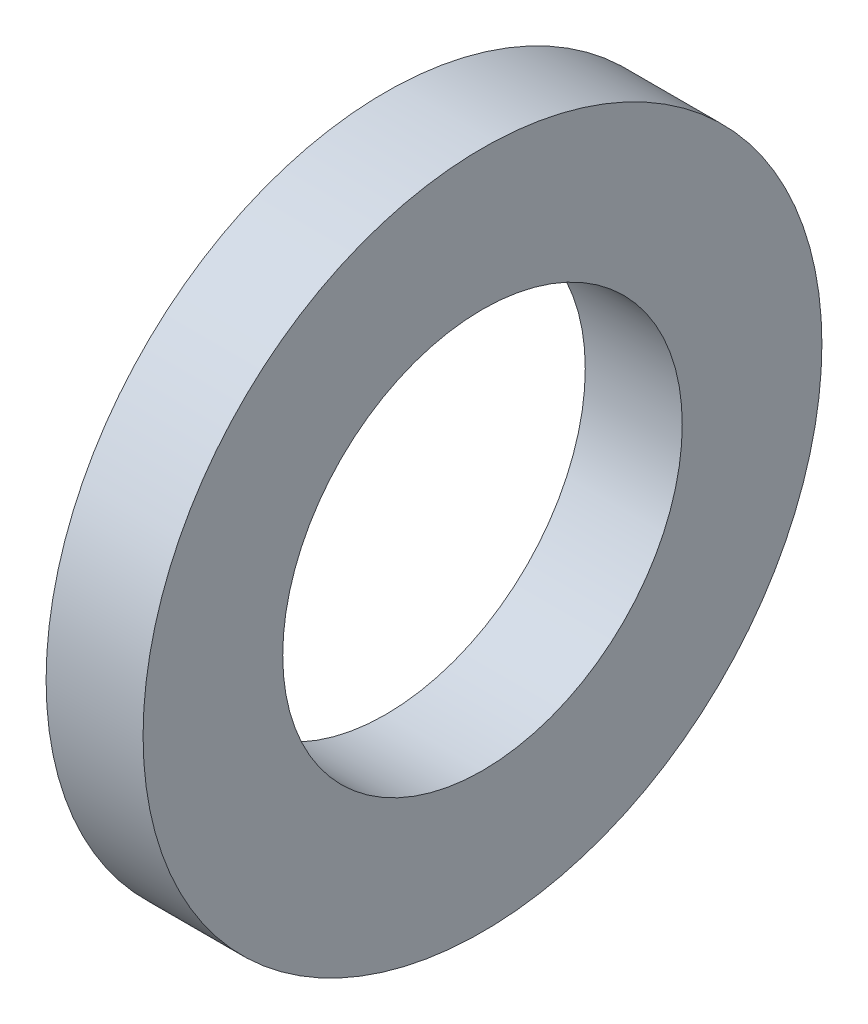
ISO-10303-21;
HEADER;
FILE_DESCRIPTION(('STEP AP214'),'2;1');
FILE_NAME('part.step','',(''),(''),'','','');
FILE_SCHEMA(('AUTOMOTIVE_DESIGN { 1 0 10303 214 1 1 1 1 }'));
ENDSEC;
DATA;
#1=APPLICATION_CONTEXT('core data for automotive mechanical design processes');
#2=APPLICATION_PROTOCOL_DEFINITION('international standard','automotive_design',2000,#1);
#3=PRODUCT_CONTEXT('',#1,'mechanical');
#4=PRODUCT('Part','Part','',(#3));
#5=PRODUCT_RELATED_PRODUCT_CATEGORY('part','',(#4));
#6=PRODUCT_DEFINITION_FORMATION('','',#4);
#7=PRODUCT_DEFINITION_CONTEXT('part definition',#1,'design');
#8=PRODUCT_DEFINITION('design','',#6,#7);
#9=PRODUCT_DEFINITION_SHAPE('','',#8);
#10=(LENGTH_UNIT() NAMED_UNIT(*) SI_UNIT(.MILLI.,.METRE.));
#11=(NAMED_UNIT(*) PLANE_ANGLE_UNIT() SI_UNIT($,.RADIAN.));
#12=(NAMED_UNIT(*) SI_UNIT($,.STERADIAN.) SOLID_ANGLE_UNIT());
#13=UNCERTAINTY_MEASURE_WITH_UNIT(LENGTH_MEASURE(1.E-05),#10,'distance_accuracy_value','');
#14=(GEOMETRIC_REPRESENTATION_CONTEXT(3) GLOBAL_UNCERTAINTY_ASSIGNED_CONTEXT((#13)) GLOBAL_UNIT_ASSIGNED_CONTEXT((#10,
#11,#12)) REPRESENTATION_CONTEXT('',''));
#15=CARTESIAN_POINT('',(0.,0.,0.));
#16=DIRECTION('',(0.,0.,1.));
#17=DIRECTION('',(1.,0.,0.));
#18=AXIS2_PLACEMENT_3D('',#15,#16,#17);
#19=CARTESIAN_POINT('',(3.175,0.,0.));
#20=DIRECTION('',(1.,0.,0.));
#21=DIRECTION('',(0.,0.,-1.));
#22=AXIS2_PLACEMENT_3D('',#19,#20,#21);
#23=PLANE('',#22);
#24=CARTESIAN_POINT('',(3.175,0.,0.));
#25=DIRECTION('',(1.,0.,0.));
#26=DIRECTION('',(0.,0.,-1.));
#27=AXIS2_PLACEMENT_3D('',#24,#25,#26);
#28=CIRCLE('',#27,11.1125);
#29=CARTESIAN_POINT('',(3.175,0.,-11.1125));
#30=VERTEX_POINT('',#29);
#31=EDGE_CURVE('E10',#30,#30,#28,.T.);
#32=ORIENTED_EDGE('',*,*,#31,.T.);
#33=EDGE_LOOP('',(#32));
#34=FACE_BOUND('',#33,.T.);
#35=CARTESIAN_POINT('',(3.175,0.,0.));
#36=DIRECTION('',(1.,0.,0.));
#37=DIRECTION('',(0.,0.,-1.));
#38=AXIS2_PLACEMENT_3D('',#35,#36,#37);
#39=CIRCLE('',#38,6.5405);
#40=CARTESIAN_POINT('',(3.175,0.,-6.5405));
#41=VERTEX_POINT('',#40);
#42=EDGE_CURVE('E42',#41,#41,#39,.T.);
#43=ORIENTED_EDGE('',*,*,#42,.F.);
#44=EDGE_LOOP('',(#43));
#45=FACE_BOUND('',#44,.T.);
#46=ADVANCED_FACE('F31',(#34,#45),#23,.T.);
#47=CARTESIAN_POINT('',(0.,0.,0.));
#48=DIRECTION('',(1.,0.,0.));
#49=DIRECTION('',(0.,0.,-1.));
#50=AXIS2_PLACEMENT_3D('',#47,#48,#49);
#51=PLANE('',#50);
#52=CARTESIAN_POINT('',(0.,0.,0.));
#53=DIRECTION('',(1.,0.,0.));
#54=DIRECTION('',(0.,0.,-1.));
#55=AXIS2_PLACEMENT_3D('',#52,#53,#54);
#56=CIRCLE('',#55,11.1125);
#57=CARTESIAN_POINT('',(0.,0.,-11.1125));
#58=VERTEX_POINT('',#57);
#59=EDGE_CURVE('E35',#58,#58,#56,.T.);
#60=ORIENTED_EDGE('',*,*,#59,.F.);
#61=EDGE_LOOP('',(#60));
#62=FACE_BOUND('',#61,.T.);
#63=CARTESIAN_POINT('',(0.,0.,0.));
#64=DIRECTION('',(1.,0.,0.));
#65=DIRECTION('',(0.,0.,-1.));
#66=AXIS2_PLACEMENT_3D('',#63,#64,#65);
#67=CIRCLE('',#66,6.5405);
#68=CARTESIAN_POINT('',(0.,0.,-6.5405));
#69=VERTEX_POINT('',#68);
#70=EDGE_CURVE('E44',#69,#69,#67,.T.);
#71=ORIENTED_EDGE('',*,*,#70,.T.);
#72=EDGE_LOOP('',(#71));
#73=FACE_BOUND('',#72,.T.);
#74=ADVANCED_FACE('F54',(#62,#73),#51,.F.);
#75=CARTESIAN_POINT('',(3.175,0.,0.));
#76=DIRECTION('',(-1.,0.,0.));
#77=DIRECTION('',(0.,0.,1.));
#78=AXIS2_PLACEMENT_3D('',#75,#76,#77);
#79=CYLINDRICAL_SURFACE('',#78,11.1125);
#80=ORIENTED_EDGE('',*,*,#31,.F.);
#81=EDGE_LOOP('',(#80));
#82=FACE_BOUND('',#81,.T.);
#83=ORIENTED_EDGE('',*,*,#59,.T.);
#84=EDGE_LOOP('',(#83));
#85=FACE_BOUND('',#84,.T.);
#86=ADVANCED_FACE('F33',(#82,#85),#79,.T.);
#87=CARTESIAN_POINT('',(3.175,0.,0.));
#88=DIRECTION('',(-1.,0.,0.));
#89=DIRECTION('',(0.,0.,1.));
#90=AXIS2_PLACEMENT_3D('',#87,#88,#89);
#91=CYLINDRICAL_SURFACE('',#90,6.5405);
#92=ORIENTED_EDGE('',*,*,#42,.T.);
#93=EDGE_LOOP('',(#92));
#94=FACE_BOUND('',#93,.T.);
#95=ORIENTED_EDGE('',*,*,#70,.F.);
#96=EDGE_LOOP('',(#95));
#97=FACE_BOUND('',#96,.T.);
#98=ADVANCED_FACE('F50',(#94,#97),#91,.F.);
#99=CLOSED_SHELL('',(#46,#74,#86,#98));
#100=MANIFOLD_SOLID_BREP('B2',#99);
#101=ADVANCED_BREP_SHAPE_REPRESENTATION('',(#18,#100),#14);
#102=SHAPE_DEFINITION_REPRESENTATION(#9,#101);
ENDSEC;
END-ISO-10303-21;
